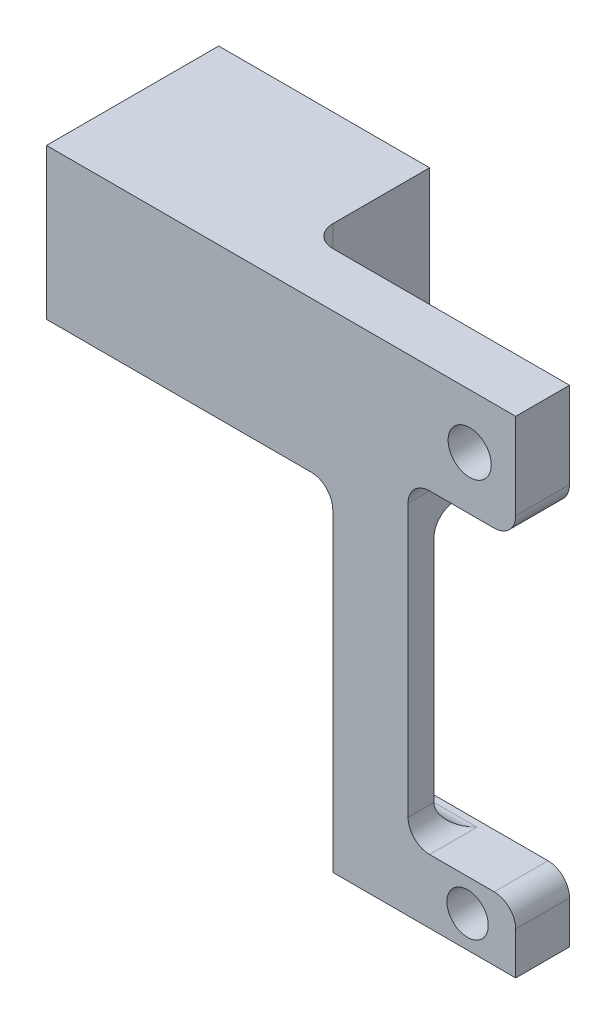
ISO-10303-21;
HEADER;
FILE_DESCRIPTION(('STEP AP214'),'2;1');
FILE_NAME('part.step','',(''),(''),'','','');
FILE_SCHEMA(('AUTOMOTIVE_DESIGN { 1 0 10303 214 1 1 1 1 }'));
ENDSEC;
DATA;
#1=APPLICATION_CONTEXT('core data for automotive mechanical design processes');
#2=APPLICATION_PROTOCOL_DEFINITION('international standard','automotive_design',2000,#1);
#3=PRODUCT_CONTEXT('',#1,'mechanical');
#4=PRODUCT('Part','Part','',(#3));
#5=PRODUCT_RELATED_PRODUCT_CATEGORY('part','',(#4));
#6=PRODUCT_DEFINITION_FORMATION('','',#4);
#7=PRODUCT_DEFINITION_CONTEXT('part definition',#1,'design');
#8=PRODUCT_DEFINITION('design','',#6,#7);
#9=PRODUCT_DEFINITION_SHAPE('','',#8);
#10=(LENGTH_UNIT() NAMED_UNIT(*) SI_UNIT(.MILLI.,.METRE.));
#11=(NAMED_UNIT(*) PLANE_ANGLE_UNIT() SI_UNIT($,.RADIAN.));
#12=(NAMED_UNIT(*) SI_UNIT($,.STERADIAN.) SOLID_ANGLE_UNIT());
#13=UNCERTAINTY_MEASURE_WITH_UNIT(LENGTH_MEASURE(1.E-05),#10,'distance_accuracy_value','');
#14=(GEOMETRIC_REPRESENTATION_CONTEXT(3) GLOBAL_UNCERTAINTY_ASSIGNED_CONTEXT((#13)) GLOBAL_UNIT_ASSIGNED_CONTEXT((#10,
#11,#12)) REPRESENTATION_CONTEXT('',''));
#15=CARTESIAN_POINT('',(0.,0.,0.));
#16=DIRECTION('',(0.,0.,1.));
#17=DIRECTION('',(1.,0.,0.));
#18=AXIS2_PLACEMENT_3D('',#15,#16,#17);
#19=CARTESIAN_POINT('',(42.672,0.,0.));
#20=DIRECTION('',(-1.,0.,0.));
#21=DIRECTION('',(0.,0.,1.));
#22=AXIS2_PLACEMENT_3D('',#19,#20,#21);
#23=PLANE('',#22);
#24=DIRECTION('',(0.,-1.,0.));
#25=VECTOR('',#24,1.);
#26=CARTESIAN_POINT('',(42.672,0.,20.32));
#27=LINE('',#26,#25);
#28=CARTESIAN_POINT('',(42.672,2.54,20.32));
#29=VERTEX_POINT('',#28);
#30=CARTESIAN_POINT('',(42.672,-29.5444696218501,20.32));
#31=VERTEX_POINT('',#30);
#32=EDGE_CURVE('E254',#29,#31,#27,.T.);
#33=ORIENTED_EDGE('',*,*,#32,.T.);
#34=DIRECTION('',(0.,0.,1.));
#35=VECTOR('',#34,1.);
#36=CARTESIAN_POINT('',(42.672,-29.5444696218501,17.272));
#37=LINE('',#36,#35);
#38=CARTESIAN_POINT('',(42.672,-29.5444696218501,17.272));
#39=VERTEX_POINT('',#38);
#40=EDGE_CURVE('E351',#31,#39,#37,.F.);
#41=ORIENTED_EDGE('',*,*,#40,.T.);
#42=DIRECTION('',(0.,1.,0.));
#43=VECTOR('',#42,1.);
#44=CARTESIAN_POINT('',(42.672,-39.624,17.272));
#45=LINE('',#44,#43);
#46=CARTESIAN_POINT('',(42.672,-2.54,17.272));
#47=VERTEX_POINT('',#46);
#48=EDGE_CURVE('E238',#39,#47,#45,.T.);
#49=ORIENTED_EDGE('',*,*,#48,.T.);
#50=CARTESIAN_POINT('',(42.672,-2.54,14.732));
#51=DIRECTION('',(-1.,0.,0.));
#52=DIRECTION('',(0.,0.,1.));
#53=AXIS2_PLACEMENT_3D('',#50,#51,#52);
#54=CIRCLE('',#53,2.54);
#55=CARTESIAN_POINT('',(42.672,0.,14.732));
#56=VERTEX_POINT('',#55);
#57=EDGE_CURVE('E361',#47,#56,#54,.T.);
#58=ORIENTED_EDGE('',*,*,#57,.T.);
#59=DIRECTION('',(0.,0.,-1.));
#60=VECTOR('',#59,1.);
#61=CARTESIAN_POINT('',(42.672,0.,20.32));
#62=LINE('',#61,#60);
#63=CARTESIAN_POINT('',(42.672,0.,13.97));
#64=VERTEX_POINT('',#63);
#65=EDGE_CURVE('E257',#56,#64,#62,.T.);
#66=ORIENTED_EDGE('',*,*,#65,.T.);
#67=DIRECTION('',(0.,1.,0.));
#68=VECTOR('',#67,1.);
#69=CARTESIAN_POINT('',(42.672,0.,13.97));
#70=LINE('',#69,#68);
#71=CARTESIAN_POINT('',(42.672,2.54,13.97));
#72=VERTEX_POINT('',#71);
#73=EDGE_CURVE('E259',#64,#72,#70,.T.);
#74=ORIENTED_EDGE('',*,*,#73,.T.);
#75=DIRECTION('',(0.,0.,-1.));
#76=VECTOR('',#75,1.);
#77=CARTESIAN_POINT('',(42.672,2.54,20.32));
#78=LINE('',#77,#76);
#79=EDGE_CURVE('E349',#72,#29,#78,.F.);
#80=ORIENTED_EDGE('',*,*,#79,.T.);
#81=EDGE_LOOP('',(#33,#41,#49,#58,#66,#74,#80));
#82=FACE_BOUND('',#81,.T.);
#83=ADVANCED_FACE('F38',(#82),#23,.F.);
#84=CARTESIAN_POINT('',(42.672,-39.624,17.272));
#85=DIRECTION('',(0.,0.,1.));
#86=DIRECTION('',(1.,0.,0.));
#87=AXIS2_PLACEMENT_3D('',#84,#85,#86);
#88=PLANE('',#87);
#89=DIRECTION('',(0.,1.,0.));
#90=VECTOR('',#89,1.);
#91=CARTESIAN_POINT('',(36.322,-39.624,17.272));
#92=LINE('',#91,#90);
#93=CARTESIAN_POINT('',(36.322,-29.5444696218501,17.272));
#94=VERTEX_POINT('',#93);
#95=CARTESIAN_POINT('',(36.322,-2.54,17.272));
#96=VERTEX_POINT('',#95);
#97=EDGE_CURVE('E305',#94,#96,#92,.T.);
#98=ORIENTED_EDGE('',*,*,#97,.T.);
#99=DIRECTION('',(1.,0.,0.));
#100=VECTOR('',#99,1.);
#101=CARTESIAN_POINT('',(42.672,-2.54,17.272));
#102=LINE('',#101,#100);
#103=EDGE_CURVE('E307',#96,#47,#102,.T.);
#104=ORIENTED_EDGE('',*,*,#103,.T.);
#105=ORIENTED_EDGE('',*,*,#48,.F.);
#106=DIRECTION('',(1.,0.,0.));
#107=VECTOR('',#106,1.);
#108=CARTESIAN_POINT('',(33.782,-29.5444696218501,17.272));
#109=LINE('',#108,#107);
#110=EDGE_CURVE('E297',#39,#94,#109,.F.);
#111=ORIENTED_EDGE('',*,*,#110,.T.);
#112=EDGE_LOOP('',(#98,#104,#105,#111));
#113=FACE_BOUND('',#112,.T.);
#114=ADVANCED_FACE('F423',(#113),#88,.F.);
#115=CARTESIAN_POINT('',(0.,0.,20.32));
#116=DIRECTION('',(0.,1.,0.));
#117=DIRECTION('',(0.,0.,1.));
#118=AXIS2_PLACEMENT_3D('',#115,#116,#117);
#119=PLANE('',#118);
#120=ORIENTED_EDGE('',*,*,#65,.F.);
#121=DIRECTION('',(1.,0.,0.));
#122=VECTOR('',#121,1.);
#123=CARTESIAN_POINT('',(33.782,0.,14.732));
#124=LINE('',#123,#122);
#125=CARTESIAN_POINT('',(36.322,0.,14.732));
#126=VERTEX_POINT('',#125);
#127=EDGE_CURVE('E315',#56,#126,#124,.F.);
#128=ORIENTED_EDGE('',*,*,#127,.T.);
#129=CARTESIAN_POINT('',(36.322,0.,19.812));
#130=DIRECTION('',(0.,1.,0.));
#131=DIRECTION('',(0.,0.,1.));
#132=AXIS2_PLACEMENT_3D('',#129,#130,#131);
#133=CIRCLE('',#132,5.08);
#134=CARTESIAN_POINT('',(31.242,0.,19.812));
#135=VERTEX_POINT('',#134);
#136=EDGE_CURVE('E312',#135,#126,#133,.F.);
#137=ORIENTED_EDGE('',*,*,#136,.F.);
#138=DIRECTION('',(0.,0.,-1.));
#139=VECTOR('',#138,1.);
#140=CARTESIAN_POINT('',(31.242,0.,20.32));
#141=LINE('',#140,#139);
#142=CARTESIAN_POINT('',(31.242,0.,20.32));
#143=VERTEX_POINT('',#142);
#144=EDGE_CURVE('E310',#135,#143,#141,.F.);
#145=ORIENTED_EDGE('',*,*,#144,.T.);
#146=DIRECTION('',(1.,0.,0.));
#147=VECTOR('',#146,1.);
#148=CARTESIAN_POINT('',(0.,0.,20.32));
#149=LINE('',#148,#147);
#150=CARTESIAN_POINT('',(0.,0.,20.32));
#151=VERTEX_POINT('',#150);
#152=EDGE_CURVE('E272',#151,#143,#149,.T.);
#153=ORIENTED_EDGE('',*,*,#152,.F.);
#154=DIRECTION('',(0.,0.,-1.));
#155=VECTOR('',#154,1.);
#156=CARTESIAN_POINT('',(0.,0.,20.32));
#157=LINE('',#156,#155);
#158=CARTESIAN_POINT('',(0.,0.,0.));
#159=VERTEX_POINT('',#158);
#160=EDGE_CURVE('E294',#151,#159,#157,.T.);
#161=ORIENTED_EDGE('',*,*,#160,.T.);
#162=DIRECTION('',(1.,0.,0.));
#163=VECTOR('',#162,1.);
#164=CARTESIAN_POINT('',(0.,0.,0.));
#165=LINE('',#164,#163);
#166=CARTESIAN_POINT('',(24.892,0.,0.));
#167=VERTEX_POINT('',#166);
#168=EDGE_CURVE('E281',#159,#167,#165,.T.);
#169=ORIENTED_EDGE('',*,*,#168,.T.);
#170=DIRECTION('',(0.,0.,-1.));
#171=VECTOR('',#170,1.);
#172=CARTESIAN_POINT('',(24.892,0.,20.32));
#173=LINE('',#172,#171);
#174=CARTESIAN_POINT('',(24.892,0.,11.43));
#175=VERTEX_POINT('',#174);
#176=EDGE_CURVE('E292',#175,#167,#173,.T.);
#177=ORIENTED_EDGE('',*,*,#176,.F.);
#178=CARTESIAN_POINT('',(27.432,0.,11.43));
#179=DIRECTION('',(0.,1.,0.));
#180=DIRECTION('',(0.,0.,1.));
#181=AXIS2_PLACEMENT_3D('',#178,#179,#180);
#182=CIRCLE('',#181,2.54);
#183=CARTESIAN_POINT('',(27.432,0.,13.97));
#184=VERTEX_POINT('',#183);
#185=EDGE_CURVE('E365',#175,#184,#182,.T.);
#186=ORIENTED_EDGE('',*,*,#185,.T.);
#187=DIRECTION('',(-1.,0.,0.));
#188=VECTOR('',#187,1.);
#189=CARTESIAN_POINT('',(42.672,0.,13.97));
#190=LINE('',#189,#188);
#191=EDGE_CURVE('E265',#64,#184,#190,.T.);
#192=ORIENTED_EDGE('',*,*,#191,.F.);
#193=EDGE_LOOP('',(#120,#128,#137,#145,#153,#161,#169,#177,#186,#192));
#194=FACE_BOUND('',#193,.T.);
#195=ADVANCED_FACE('F429',(#194),#119,.F.);
#196=CARTESIAN_POINT('',(24.892,0.,20.32));
#197=DIRECTION('',(-1.,0.,0.));
#198=DIRECTION('',(0.,0.,1.));
#199=AXIS2_PLACEMENT_3D('',#196,#197,#198);
#200=PLANE('',#199);
#201=DIRECTION('',(0.,0.,-1.));
#202=VECTOR('',#201,1.);
#203=CARTESIAN_POINT('',(24.892,17.78,20.32));
#204=LINE('',#203,#202);
#205=CARTESIAN_POINT('',(24.892,17.78,11.43));
#206=VERTEX_POINT('',#205);
#207=CARTESIAN_POINT('',(24.892,17.78,0.));
#208=VERTEX_POINT('',#207);
#209=EDGE_CURVE('E290',#206,#208,#204,.T.);
#210=ORIENTED_EDGE('',*,*,#209,.F.);
#211=DIRECTION('',(0.,1.,0.));
#212=VECTOR('',#211,1.);
#213=CARTESIAN_POINT('',(24.892,0.,11.43));
#214=LINE('',#213,#212);
#215=EDGE_CURVE('E343',#206,#175,#214,.F.);
#216=ORIENTED_EDGE('',*,*,#215,.T.);
#217=ORIENTED_EDGE('',*,*,#176,.T.);
#218=DIRECTION('',(0.,1.,0.));
#219=VECTOR('',#218,1.);
#220=CARTESIAN_POINT('',(24.892,0.,0.));
#221=LINE('',#220,#219);
#222=EDGE_CURVE('E284',#167,#208,#221,.T.);
#223=ORIENTED_EDGE('',*,*,#222,.T.);
#224=EDGE_LOOP('',(#210,#216,#217,#223));
#225=FACE_BOUND('',#224,.T.);
#226=ADVANCED_FACE('F457',(#225),#200,.F.);
#227=CARTESIAN_POINT('',(0.,0.,20.32));
#228=DIRECTION('',(1.,0.,0.));
#229=DIRECTION('',(0.,0.,-1.));
#230=AXIS2_PLACEMENT_3D('',#227,#228,#229);
#231=PLANE('',#230);
#232=DIRECTION('',(0.,-1.,0.));
#233=VECTOR('',#232,1.);
#234=CARTESIAN_POINT('',(0.,0.,0.));
#235=LINE('',#234,#233);
#236=CARTESIAN_POINT('',(0.,17.78,0.));
#237=VERTEX_POINT('',#236);
#238=EDGE_CURVE('E268',#237,#159,#235,.T.);
#239=ORIENTED_EDGE('',*,*,#238,.T.);
#240=ORIENTED_EDGE('',*,*,#160,.F.);
#241=DIRECTION('',(0.,-1.,0.));
#242=VECTOR('',#241,1.);
#243=CARTESIAN_POINT('',(0.,0.,20.32));
#244=LINE('',#243,#242);
#245=CARTESIAN_POINT('',(0.,17.78,20.32));
#246=VERTEX_POINT('',#245);
#247=EDGE_CURVE('E269',#246,#151,#244,.T.);
#248=ORIENTED_EDGE('',*,*,#247,.F.);
#249=DIRECTION('',(0.,0.,-1.));
#250=VECTOR('',#249,1.);
#251=CARTESIAN_POINT('',(0.,17.78,20.32));
#252=LINE('',#251,#250);
#253=EDGE_CURVE('E278',#246,#237,#252,.T.);
#254=ORIENTED_EDGE('',*,*,#253,.T.);
#255=EDGE_LOOP('',(#239,#240,#248,#254));
#256=FACE_BOUND('',#255,.T.);
#257=ADVANCED_FACE('F418',(#256),#231,.F.);
#258=CARTESIAN_POINT('',(0.,17.78,20.32));
#259=DIRECTION('',(0.,-1.,0.));
#260=DIRECTION('',(0.,0.,-1.));
#261=AXIS2_PLACEMENT_3D('',#258,#259,#260);
#262=PLANE('',#261);
#263=DIRECTION('',(-1.,0.,0.));
#264=VECTOR('',#263,1.);
#265=CARTESIAN_POINT('',(0.,17.78,0.));
#266=LINE('',#265,#264);
#267=EDGE_CURVE('E273',#208,#237,#266,.T.);
#268=ORIENTED_EDGE('',*,*,#267,.T.);
#269=ORIENTED_EDGE('',*,*,#253,.F.);
#270=DIRECTION('',(-1.,0.,0.));
#271=VECTOR('',#270,1.);
#272=CARTESIAN_POINT('',(0.,17.78,20.32));
#273=LINE('',#272,#271);
#274=CARTESIAN_POINT('',(55.372,17.78,20.32));
#275=VERTEX_POINT('',#274);
#276=EDGE_CURVE('E276',#275,#246,#273,.T.);
#277=ORIENTED_EDGE('',*,*,#276,.F.);
#278=DIRECTION('',(0.,0.,1.));
#279=VECTOR('',#278,1.);
#280=CARTESIAN_POINT('',(55.372,17.78,13.97));
#281=LINE('',#280,#279);
#282=CARTESIAN_POINT('',(55.372,17.78,13.97));
#283=VERTEX_POINT('',#282);
#284=EDGE_CURVE('E244',#283,#275,#281,.T.);
#285=ORIENTED_EDGE('',*,*,#284,.F.);
#286=DIRECTION('',(-1.,0.,0.));
#287=VECTOR('',#286,1.);
#288=CARTESIAN_POINT('',(42.672,17.78,13.97));
#289=LINE('',#288,#287);
#290=CARTESIAN_POINT('',(27.432,17.78,13.97));
#291=VERTEX_POINT('',#290);
#292=EDGE_CURVE('E262',#283,#291,#289,.T.);
#293=ORIENTED_EDGE('',*,*,#292,.T.);
#294=CARTESIAN_POINT('',(27.432,17.78,11.43));
#295=DIRECTION('',(0.,-1.,0.));
#296=DIRECTION('',(0.,0.,-1.));
#297=AXIS2_PLACEMENT_3D('',#294,#295,#296);
#298=CIRCLE('',#297,2.54);
#299=EDGE_CURVE('E363',#291,#206,#298,.T.);
#300=ORIENTED_EDGE('',*,*,#299,.T.);
#301=ORIENTED_EDGE('',*,*,#209,.T.);
#302=EDGE_LOOP('',(#268,#269,#277,#285,#293,#300,#301));
#303=FACE_BOUND('',#302,.T.);
#304=ADVANCED_FACE('F409',(#303),#262,.F.);
#305=CARTESIAN_POINT('',(0.,0.,20.32));
#306=DIRECTION('',(0.,0.,-1.));
#307=DIRECTION('',(-1.,0.,0.));
#308=AXIS2_PLACEMENT_3D('',#305,#306,#307);
#309=PLANE('',#308);
#310=CARTESIAN_POINT('',(49.9402134721156,11.366437705175,20.32));
#311=DIRECTION('',(0.,0.,1.));
#312=DIRECTION('',(1.,0.,0.));
#313=AXIS2_PLACEMENT_3D('',#310,#311,#312);
#314=CIRCLE('',#313,2.54768628076785);
#315=CARTESIAN_POINT('',(52.4878997528835,11.366437705175,20.32));
#316=VERTEX_POINT('',#315);
#317=EDGE_CURVE('E301',#316,#316,#314,.T.);
#318=ORIENTED_EDGE('',*,*,#317,.F.);
#319=EDGE_LOOP('',(#318));
#320=FACE_BOUND('',#319,.T.);
#321=CARTESIAN_POINT('',(49.6931777417928,-35.877562294825,20.32));
#322=DIRECTION('',(0.,0.,1.));
#323=DIRECTION('',(1.,0.,0.));
#324=AXIS2_PLACEMENT_3D('',#321,#322,#323);
#325=CIRCLE('',#324,2.43923779274074);
#326=CARTESIAN_POINT('',(52.1324155345335,-35.877562294825,20.32));
#327=VERTEX_POINT('',#326);
#328=EDGE_CURVE('E391',#327,#327,#325,.T.);
#329=ORIENTED_EDGE('',*,*,#328,.F.);
#330=EDGE_LOOP('',(#329));
#331=FACE_BOUND('',#330,.T.);
#332=DIRECTION('',(0.,-1.,0.));
#333=VECTOR('',#332,1.);
#334=CARTESIAN_POINT('',(55.372,-39.624,20.32));
#335=LINE('',#334,#333);
#336=CARTESIAN_POINT('',(55.372,-34.6244696218501,20.32));
#337=VERTEX_POINT('',#336);
#338=CARTESIAN_POINT('',(55.372,-39.624,20.32));
#339=VERTEX_POINT('',#338);
#340=EDGE_CURVE('E199',#337,#339,#335,.T.);
#341=ORIENTED_EDGE('',*,*,#340,.F.);
#342=CARTESIAN_POINT('',(52.832,-34.6244696218501,20.32));
#343=DIRECTION('',(0.,0.,-1.));
#344=DIRECTION('',(-1.,0.,0.));
#345=AXIS2_PLACEMENT_3D('',#342,#343,#344);
#346=CIRCLE('',#345,2.54);
#347=CARTESIAN_POINT('',(52.832,-32.0844696218501,20.32));
#348=VERTEX_POINT('',#347);
#349=EDGE_CURVE('E347',#337,#348,#346,.F.);
#350=ORIENTED_EDGE('',*,*,#349,.T.);
#351=DIRECTION('',(-1.,0.,0.));
#352=VECTOR('',#351,1.);
#353=CARTESIAN_POINT('',(55.372,-32.0844696218501,20.32));
#354=LINE('',#353,#352);
#355=CARTESIAN_POINT('',(45.212,-32.0844696218501,20.32));
#356=VERTEX_POINT('',#355);
#357=EDGE_CURVE('E224',#348,#356,#354,.T.);
#358=ORIENTED_EDGE('',*,*,#357,.T.);
#359=CARTESIAN_POINT('',(45.212,-29.5444696218501,20.32));
#360=DIRECTION('',(0.,0.,-1.));
#361=DIRECTION('',(-1.,0.,0.));
#362=AXIS2_PLACEMENT_3D('',#359,#360,#361);
#363=CIRCLE('',#362,2.54);
#364=EDGE_CURVE('E369',#356,#31,#363,.T.);
#365=ORIENTED_EDGE('',*,*,#364,.T.);
#366=ORIENTED_EDGE('',*,*,#32,.F.);
#367=CARTESIAN_POINT('',(45.212,2.54,20.32));
#368=DIRECTION('',(0.,0.,-1.));
#369=DIRECTION('',(-1.,0.,0.));
#370=AXIS2_PLACEMENT_3D('',#367,#368,#369);
#371=CIRCLE('',#370,2.54);
#372=CARTESIAN_POINT('',(45.212,5.08,20.32));
#373=VERTEX_POINT('',#372);
#374=EDGE_CURVE('E11',#29,#373,#371,.T.);
#375=ORIENTED_EDGE('',*,*,#374,.T.);
#376=DIRECTION('',(-1.,0.,0.));
#377=VECTOR('',#376,1.);
#378=CARTESIAN_POINT('',(55.372,5.08,20.32));
#379=LINE('',#378,#377);
#380=CARTESIAN_POINT('',(52.832,5.08,20.32));
#381=VERTEX_POINT('',#380);
#382=EDGE_CURVE('E252',#381,#373,#379,.T.);
#383=ORIENTED_EDGE('',*,*,#382,.F.);
#384=CARTESIAN_POINT('',(52.832,7.62,20.32));
#385=DIRECTION('',(0.,0.,-1.));
#386=DIRECTION('',(-1.,0.,0.));
#387=AXIS2_PLACEMENT_3D('',#384,#385,#386);
#388=CIRCLE('',#387,2.54);
#389=CARTESIAN_POINT('',(55.372,7.62,20.32));
#390=VERTEX_POINT('',#389);
#391=EDGE_CURVE('E55',#381,#390,#388,.F.);
#392=ORIENTED_EDGE('',*,*,#391,.T.);
#393=DIRECTION('',(0.,-1.,0.));
#394=VECTOR('',#393,1.);
#395=CARTESIAN_POINT('',(55.372,17.78,20.32));
#396=LINE('',#395,#394);
#397=EDGE_CURVE('E247',#275,#390,#396,.T.);
#398=ORIENTED_EDGE('',*,*,#397,.F.);
#399=ORIENTED_EDGE('',*,*,#276,.T.);
#400=ORIENTED_EDGE('',*,*,#247,.T.);
#401=ORIENTED_EDGE('',*,*,#152,.T.);
#402=CARTESIAN_POINT('',(31.242,-2.54,20.32));
#403=DIRECTION('',(0.,0.,-1.));
#404=DIRECTION('',(-1.,0.,0.));
#405=AXIS2_PLACEMENT_3D('',#402,#403,#404);
#406=CIRCLE('',#405,2.54);
#407=CARTESIAN_POINT('',(33.782,-2.54,20.32));
#408=VERTEX_POINT('',#407);
#409=EDGE_CURVE('E367',#143,#408,#406,.T.);
#410=ORIENTED_EDGE('',*,*,#409,.T.);
#411=DIRECTION('',(0.,1.,0.));
#412=VECTOR('',#411,1.);
#413=CARTESIAN_POINT('',(33.782,-39.624,20.32));
#414=LINE('',#413,#412);
#415=CARTESIAN_POINT('',(33.782,-39.624,20.32));
#416=VERTEX_POINT('',#415);
#417=EDGE_CURVE('E214',#416,#408,#414,.T.);
#418=ORIENTED_EDGE('',*,*,#417,.F.);
#419=DIRECTION('',(-1.,0.,0.));
#420=VECTOR('',#419,1.);
#421=CARTESIAN_POINT('',(42.672,-39.624,20.32));
#422=LINE('',#421,#420);
#423=EDGE_CURVE('E211',#339,#416,#422,.T.);
#424=ORIENTED_EDGE('',*,*,#423,.F.);
#425=EDGE_LOOP('',(#341,#350,#358,#365,#366,#375,#383,#392,#398,#399,#400,#401,#410,#418,#424));
#426=FACE_BOUND('',#425,.T.);
#427=ADVANCED_FACE('F212',(#320,#331,#426),#309,.F.);
#428=CARTESIAN_POINT('',(0.,0.,0.));
#429=DIRECTION('',(0.,0.,-1.));
#430=DIRECTION('',(-1.,0.,0.));
#431=AXIS2_PLACEMENT_3D('',#428,#429,#430);
#432=PLANE('',#431);
#433=ORIENTED_EDGE('',*,*,#238,.F.);
#434=ORIENTED_EDGE('',*,*,#267,.F.);
#435=ORIENTED_EDGE('',*,*,#222,.F.);
#436=ORIENTED_EDGE('',*,*,#168,.F.);
#437=EDGE_LOOP('',(#433,#434,#435,#436));
#438=FACE_BOUND('',#437,.T.);
#439=ADVANCED_FACE('F408',(#438),#432,.T.);
#440=CARTESIAN_POINT('',(42.672,0.,13.97));
#441=DIRECTION('',(0.,0.,1.));
#442=DIRECTION('',(1.,0.,0.));
#443=AXIS2_PLACEMENT_3D('',#440,#441,#442);
#444=PLANE('',#443);
#445=CARTESIAN_POINT('',(49.9402134721156,11.366437705175,13.97));
#446=DIRECTION('',(0.,0.,1.));
#447=DIRECTION('',(1.,0.,0.));
#448=AXIS2_PLACEMENT_3D('',#445,#446,#447);
#449=CIRCLE('',#448,2.54768628076785);
#450=CARTESIAN_POINT('',(52.4878997528835,11.366437705175,13.97));
#451=VERTEX_POINT('',#450);
#452=EDGE_CURVE('E208',#451,#451,#449,.T.);
#453=ORIENTED_EDGE('',*,*,#452,.T.);
#454=EDGE_LOOP('',(#453));
#455=FACE_BOUND('',#454,.T.);
#456=ORIENTED_EDGE('',*,*,#191,.T.);
#457=DIRECTION('',(0.,1.,0.));
#458=VECTOR('',#457,1.);
#459=CARTESIAN_POINT('',(27.432,17.78,13.97));
#460=LINE('',#459,#458);
#461=EDGE_CURVE('E340',#184,#291,#460,.T.);
#462=ORIENTED_EDGE('',*,*,#461,.T.);
#463=ORIENTED_EDGE('',*,*,#292,.F.);
#464=DIRECTION('',(0.,1.,0.));
#465=VECTOR('',#464,1.);
#466=CARTESIAN_POINT('',(55.372,17.78,13.97));
#467=LINE('',#466,#465);
#468=CARTESIAN_POINT('',(55.372,7.62,13.97));
#469=VERTEX_POINT('',#468);
#470=EDGE_CURVE('E242',#469,#283,#467,.T.);
#471=ORIENTED_EDGE('',*,*,#470,.F.);
#472=CARTESIAN_POINT('',(52.832,7.62,13.97));
#473=DIRECTION('',(0.,0.,1.));
#474=DIRECTION('',(1.,0.,0.));
#475=AXIS2_PLACEMENT_3D('',#472,#473,#474);
#476=CIRCLE('',#475,2.54);
#477=CARTESIAN_POINT('',(52.832,5.08,13.97));
#478=VERTEX_POINT('',#477);
#479=EDGE_CURVE('E338',#469,#478,#476,.F.);
#480=ORIENTED_EDGE('',*,*,#479,.T.);
#481=DIRECTION('',(-1.,0.,0.));
#482=VECTOR('',#481,1.);
#483=CARTESIAN_POINT('',(55.372,5.08,13.97));
#484=LINE('',#483,#482);
#485=CARTESIAN_POINT('',(45.212,5.08,13.97));
#486=VERTEX_POINT('',#485);
#487=EDGE_CURVE('E249',#478,#486,#484,.T.);
#488=ORIENTED_EDGE('',*,*,#487,.T.);
#489=CARTESIAN_POINT('',(45.212,2.54,13.97));
#490=DIRECTION('',(0.,0.,1.));
#491=DIRECTION('',(1.,0.,0.));
#492=AXIS2_PLACEMENT_3D('',#489,#490,#491);
#493=CIRCLE('',#492,2.54);
#494=EDGE_CURVE('E47',#486,#72,#493,.T.);
#495=ORIENTED_EDGE('',*,*,#494,.T.);
#496=ORIENTED_EDGE('',*,*,#73,.F.);
#497=EDGE_LOOP('',(#456,#462,#463,#471,#480,#488,#495,#496));
#498=FACE_BOUND('',#497,.T.);
#499=ADVANCED_FACE('F415',(#455,#498),#444,.F.);
#500=CARTESIAN_POINT('',(55.372,5.08,13.97));
#501=DIRECTION('',(0.,1.,0.));
#502=DIRECTION('',(0.,0.,1.));
#503=AXIS2_PLACEMENT_3D('',#500,#501,#502);
#504=PLANE('',#503);
#505=ORIENTED_EDGE('',*,*,#487,.F.);
#506=DIRECTION('',(0.,0.,-1.));
#507=VECTOR('',#506,1.);
#508=CARTESIAN_POINT('',(52.832,5.08,13.97));
#509=LINE('',#508,#507);
#510=EDGE_CURVE('E359',#478,#381,#509,.F.);
#511=ORIENTED_EDGE('',*,*,#510,.T.);
#512=ORIENTED_EDGE('',*,*,#382,.T.);
#513=DIRECTION('',(0.,0.,-1.));
#514=VECTOR('',#513,1.);
#515=CARTESIAN_POINT('',(45.212,5.08,13.97));
#516=LINE('',#515,#514);
#517=EDGE_CURVE('E356',#373,#486,#516,.T.);
#518=ORIENTED_EDGE('',*,*,#517,.T.);
#519=EDGE_LOOP('',(#505,#511,#512,#518));
#520=FACE_BOUND('',#519,.T.);
#521=ADVANCED_FACE('F433',(#520),#504,.F.);
#522=CARTESIAN_POINT('',(55.372,0.,0.));
#523=DIRECTION('',(-1.,0.,0.));
#524=DIRECTION('',(0.,0.,1.));
#525=AXIS2_PLACEMENT_3D('',#522,#523,#524);
#526=PLANE('',#525);
#527=ORIENTED_EDGE('',*,*,#397,.T.);
#528=DIRECTION('',(0.,0.,-1.));
#529=VECTOR('',#528,1.);
#530=CARTESIAN_POINT('',(55.372,7.62,0.));
#531=LINE('',#530,#529);
#532=EDGE_CURVE('E353',#390,#469,#531,.T.);
#533=ORIENTED_EDGE('',*,*,#532,.T.);
#534=ORIENTED_EDGE('',*,*,#470,.T.);
#535=ORIENTED_EDGE('',*,*,#284,.T.);
#536=EDGE_LOOP('',(#527,#533,#534,#535));
#537=FACE_BOUND('',#536,.T.);
#538=ADVANCED_FACE('F440',(#537),#526,.F.);
#539=CARTESIAN_POINT('',(33.782,-39.624,20.32));
#540=DIRECTION('',(1.,0.,0.));
#541=DIRECTION('',(0.,0.,-1.));
#542=AXIS2_PLACEMENT_3D('',#539,#540,#541);
#543=PLANE('',#542);
#544=CARTESIAN_POINT('',(33.782,-29.5444696218501,14.732));
#545=DIRECTION('',(1.,0.,0.));
#546=DIRECTION('',(0.,0.,-1.));
#547=AXIS2_PLACEMENT_3D('',#544,#545,#546);
#548=CIRCLE('',#547,5.08);
#549=CARTESIAN_POINT('',(33.782,-34.6244696218501,14.732));
#550=VERTEX_POINT('',#549);
#551=CARTESIAN_POINT('',(33.782,-29.5444696218501,19.812));
#552=VERTEX_POINT('',#551);
#553=EDGE_CURVE('E321',#550,#552,#548,.F.);
#554=ORIENTED_EDGE('',*,*,#553,.F.);
#555=DIRECTION('',(0.,0.,1.));
#556=VECTOR('',#555,1.);
#557=CARTESIAN_POINT('',(33.782,-34.6244696218501,20.32));
#558=LINE('',#557,#556);
#559=CARTESIAN_POINT('',(33.782,-34.6244696218501,13.97));
#560=VERTEX_POINT('',#559);
#561=EDGE_CURVE('E324',#550,#560,#558,.F.);
#562=ORIENTED_EDGE('',*,*,#561,.T.);
#563=DIRECTION('',(0.,1.,0.));
#564=VECTOR('',#563,1.);
#565=CARTESIAN_POINT('',(33.782,-39.624,13.97));
#566=LINE('',#565,#564);
#567=CARTESIAN_POINT('',(33.782,-39.624,13.97));
#568=VERTEX_POINT('',#567);
#569=EDGE_CURVE('E230',#568,#560,#566,.T.);
#570=ORIENTED_EDGE('',*,*,#569,.F.);
#571=DIRECTION('',(0.,0.,-1.));
#572=VECTOR('',#571,1.);
#573=CARTESIAN_POINT('',(33.782,-39.624,20.32));
#574=LINE('',#573,#572);
#575=EDGE_CURVE('E217',#416,#568,#574,.T.);
#576=ORIENTED_EDGE('',*,*,#575,.F.);
#577=ORIENTED_EDGE('',*,*,#417,.T.);
#578=DIRECTION('',(0.,0.,-1.));
#579=VECTOR('',#578,1.);
#580=CARTESIAN_POINT('',(33.782,-2.54,17.272));
#581=LINE('',#580,#579);
#582=CARTESIAN_POINT('',(33.782,-2.54,19.812));
#583=VERTEX_POINT('',#582);
#584=EDGE_CURVE('E317',#408,#583,#581,.T.);
#585=ORIENTED_EDGE('',*,*,#584,.T.);
#586=DIRECTION('',(0.,1.,0.));
#587=VECTOR('',#586,1.);
#588=CARTESIAN_POINT('',(33.782,-39.624,19.812));
#589=LINE('',#588,#587);
#590=EDGE_CURVE('E319',#583,#552,#589,.F.);
#591=ORIENTED_EDGE('',*,*,#590,.T.);
#592=EDGE_LOOP('',(#554,#562,#570,#576,#577,#585,#591));
#593=FACE_BOUND('',#592,.T.);
#594=ADVANCED_FACE('F564',(#593),#543,.F.);
#595=CARTESIAN_POINT('',(0.,-39.624,0.));
#596=DIRECTION('',(0.,1.,0.));
#597=DIRECTION('',(0.,0.,1.));
#598=AXIS2_PLACEMENT_3D('',#595,#596,#597);
#599=PLANE('',#598);
#600=DIRECTION('',(-1.,0.,0.));
#601=VECTOR('',#600,1.);
#602=CARTESIAN_POINT('',(33.782,-39.624,13.97));
#603=LINE('',#602,#601);
#604=CARTESIAN_POINT('',(55.372,-39.624,13.97));
#605=VERTEX_POINT('',#604);
#606=EDGE_CURVE('E218',#605,#568,#603,.T.);
#607=ORIENTED_EDGE('',*,*,#606,.F.);
#608=DIRECTION('',(0.,0.,-1.));
#609=VECTOR('',#608,1.);
#610=CARTESIAN_POINT('',(55.372,-39.624,20.32));
#611=LINE('',#610,#609);
#612=EDGE_CURVE('E204',#339,#605,#611,.T.);
#613=ORIENTED_EDGE('',*,*,#612,.F.);
#614=ORIENTED_EDGE('',*,*,#423,.T.);
#615=ORIENTED_EDGE('',*,*,#575,.T.);
#616=EDGE_LOOP('',(#607,#613,#614,#615));
#617=FACE_BOUND('',#616,.T.);
#618=ADVANCED_FACE('F220',(#617),#599,.F.);
#619=CARTESIAN_POINT('',(33.782,-32.0844696218501,13.97));
#620=DIRECTION('',(0.,-1.,0.));
#621=DIRECTION('',(0.,0.,-1.));
#622=AXIS2_PLACEMENT_3D('',#619,#620,#621);
#623=PLANE('',#622);
#624=ORIENTED_EDGE('',*,*,#357,.F.);
#625=DIRECTION('',(0.,0.,1.));
#626=VECTOR('',#625,1.);
#627=CARTESIAN_POINT('',(52.832,-32.0844696218501,13.97));
#628=LINE('',#627,#626);
#629=CARTESIAN_POINT('',(52.832,-32.0844696218501,13.97));
#630=VERTEX_POINT('',#629);
#631=EDGE_CURVE('E332',#348,#630,#628,.F.);
#632=ORIENTED_EDGE('',*,*,#631,.T.);
#633=DIRECTION('',(1.,0.,0.));
#634=VECTOR('',#633,1.);
#635=CARTESIAN_POINT('',(33.782,-32.0844696218501,13.97));
#636=LINE('',#635,#634);
#637=CARTESIAN_POINT('',(36.322,-32.0844696218501,13.97));
#638=VERTEX_POINT('',#637);
#639=EDGE_CURVE('E233',#638,#630,#636,.T.);
#640=ORIENTED_EDGE('',*,*,#639,.F.);
#641=DIRECTION('',(0.,0.,1.));
#642=VECTOR('',#641,1.);
#643=CARTESIAN_POINT('',(36.322,-32.0844696218501,13.97));
#644=LINE('',#643,#642);
#645=CARTESIAN_POINT('',(36.322,-32.0844696218501,14.732));
#646=VERTEX_POINT('',#645);
#647=EDGE_CURVE('E330',#638,#646,#644,.T.);
#648=ORIENTED_EDGE('',*,*,#647,.T.);
#649=DIRECTION('',(1.,0.,0.));
#650=VECTOR('',#649,1.);
#651=CARTESIAN_POINT('',(42.672,-32.0844696218501,14.732));
#652=LINE('',#651,#650);
#653=CARTESIAN_POINT('',(45.212,-32.0844696218501,14.732));
#654=VERTEX_POINT('',#653);
#655=EDGE_CURVE('E328',#646,#654,#652,.T.);
#656=ORIENTED_EDGE('',*,*,#655,.T.);
#657=DIRECTION('',(0.,0.,1.));
#658=VECTOR('',#657,1.);
#659=CARTESIAN_POINT('',(45.212,-32.0844696218501,20.32));
#660=LINE('',#659,#658);
#661=EDGE_CURVE('E326',#654,#356,#660,.T.);
#662=ORIENTED_EDGE('',*,*,#661,.T.);
#663=EDGE_LOOP('',(#624,#632,#640,#648,#656,#662));
#664=FACE_BOUND('',#663,.T.);
#665=ADVANCED_FACE('F582',(#664),#623,.F.);
#666=CARTESIAN_POINT('',(0.,0.,13.97));
#667=DIRECTION('',(0.,0.,-1.));
#668=DIRECTION('',(-1.,0.,0.));
#669=AXIS2_PLACEMENT_3D('',#666,#667,#668);
#670=PLANE('',#669);
#671=CARTESIAN_POINT('',(49.6931777417928,-35.877562294825,13.97));
#672=DIRECTION('',(0.,0.,-1.));
#673=DIRECTION('',(-1.,0.,0.));
#674=AXIS2_PLACEMENT_3D('',#671,#672,#673);
#675=CIRCLE('',#674,2.43923779274074);
#676=CARTESIAN_POINT('',(47.2539399490521,-35.877562294825,13.97));
#677=VERTEX_POINT('',#676);
#678=EDGE_CURVE('E298',#677,#677,#675,.T.);
#679=ORIENTED_EDGE('',*,*,#678,.F.);
#680=EDGE_LOOP('',(#679));
#681=FACE_BOUND('',#680,.T.);
#682=ORIENTED_EDGE('',*,*,#569,.T.);
#683=CARTESIAN_POINT('',(36.322,-34.6244696218501,13.97));
#684=DIRECTION('',(0.,0.,-1.));
#685=DIRECTION('',(-1.,0.,0.));
#686=AXIS2_PLACEMENT_3D('',#683,#684,#685);
#687=CIRCLE('',#686,2.54);
#688=EDGE_CURVE('E336',#560,#638,#687,.T.);
#689=ORIENTED_EDGE('',*,*,#688,.T.);
#690=ORIENTED_EDGE('',*,*,#639,.T.);
#691=CARTESIAN_POINT('',(52.832,-34.6244696218501,13.97));
#692=DIRECTION('',(0.,0.,-1.));
#693=DIRECTION('',(-1.,0.,0.));
#694=AXIS2_PLACEMENT_3D('',#691,#692,#693);
#695=CIRCLE('',#694,2.54);
#696=CARTESIAN_POINT('',(55.372,-34.6244696218501,13.97));
#697=VERTEX_POINT('',#696);
#698=EDGE_CURVE('E334',#630,#697,#695,.T.);
#699=ORIENTED_EDGE('',*,*,#698,.T.);
#700=DIRECTION('',(0.,1.,0.));
#701=VECTOR('',#700,1.);
#702=CARTESIAN_POINT('',(55.372,-39.624,13.97));
#703=LINE('',#702,#701);
#704=EDGE_CURVE('E222',#605,#697,#703,.T.);
#705=ORIENTED_EDGE('',*,*,#704,.F.);
#706=ORIENTED_EDGE('',*,*,#606,.T.);
#707=EDGE_LOOP('',(#682,#689,#690,#699,#705,#706));
#708=FACE_BOUND('',#707,.T.);
#709=ADVANCED_FACE('F587',(#681,#708),#670,.T.);
#710=CARTESIAN_POINT('',(55.372,0.,0.));
#711=DIRECTION('',(-1.,0.,0.));
#712=DIRECTION('',(0.,0.,1.));
#713=AXIS2_PLACEMENT_3D('',#710,#711,#712);
#714=PLANE('',#713);
#715=ORIENTED_EDGE('',*,*,#704,.T.);
#716=DIRECTION('',(0.,0.,1.));
#717=VECTOR('',#716,1.);
#718=CARTESIAN_POINT('',(55.372,-34.6244696218501,0.));
#719=LINE('',#718,#717);
#720=EDGE_CURVE('E207',#697,#337,#719,.T.);
#721=ORIENTED_EDGE('',*,*,#720,.T.);
#722=ORIENTED_EDGE('',*,*,#340,.T.);
#723=ORIENTED_EDGE('',*,*,#612,.T.);
#724=EDGE_LOOP('',(#715,#721,#722,#723));
#725=FACE_BOUND('',#724,.T.);
#726=ADVANCED_FACE('F202',(#725),#714,.F.);
#727=CARTESIAN_POINT('',(49.6931777417928,-35.877562294825,0.));
#728=DIRECTION('',(0.,0.,1.));
#729=DIRECTION('',(1.,0.,0.));
#730=AXIS2_PLACEMENT_3D('',#727,#728,#729);
#731=CYLINDRICAL_SURFACE('',#730,2.43923779274074);
#732=ORIENTED_EDGE('',*,*,#678,.T.);
#733=EDGE_LOOP('',(#732));
#734=FACE_BOUND('',#733,.T.);
#735=ORIENTED_EDGE('',*,*,#328,.T.);
#736=EDGE_LOOP('',(#735));
#737=FACE_BOUND('',#736,.T.);
#738=ADVANCED_FACE('F608',(#734,#737),#731,.F.);
#739=CARTESIAN_POINT('',(49.9402134721156,11.366437705175,0.));
#740=DIRECTION('',(0.,0.,1.));
#741=DIRECTION('',(1.,0.,0.));
#742=AXIS2_PLACEMENT_3D('',#739,#740,#741);
#743=CYLINDRICAL_SURFACE('',#742,2.54768628076785);
#744=ORIENTED_EDGE('',*,*,#317,.T.);
#745=EDGE_LOOP('',(#744));
#746=FACE_BOUND('',#745,.T.);
#747=ORIENTED_EDGE('',*,*,#452,.F.);
#748=EDGE_LOOP('',(#747));
#749=FACE_BOUND('',#748,.T.);
#750=ADVANCED_FACE('F403',(#746,#749),#743,.F.);
#751=CARTESIAN_POINT('',(45.212,-29.5444696218501,13.97));
#752=DIRECTION('',(0.,0.,-1.));
#753=DIRECTION('',(-1.,0.,0.));
#754=AXIS2_PLACEMENT_3D('',#751,#752,#753);
#755=CYLINDRICAL_SURFACE('',#754,2.54);
#756=ORIENTED_EDGE('',*,*,#364,.F.);
#757=ORIENTED_EDGE('',*,*,#661,.F.);
#758=CARTESIAN_POINT('',(45.212,-29.5444696218501,14.732));
#759=DIRECTION('',(-0.707106781186547,0.,-0.707106781186548));
#760=DIRECTION('',(0.707106781186548,0.,-0.707106781186547));
#761=AXIS2_PLACEMENT_3D('',#758,#759,#760);
#762=ELLIPSE('',#761,3.59210244842766,2.54);
#763=EDGE_CURVE('E42',#39,#654,#762,.F.);
#764=ORIENTED_EDGE('',*,*,#763,.F.);
#765=ORIENTED_EDGE('',*,*,#40,.F.);
#766=EDGE_LOOP('',(#756,#757,#764,#765));
#767=FACE_BOUND('',#766,.T.);
#768=ADVANCED_FACE('F488',(#767),#755,.F.);
#769=CARTESIAN_POINT('',(36.322,-34.6244696218501,13.97));
#770=DIRECTION('',(0.,0.,1.));
#771=DIRECTION('',(1.,0.,0.));
#772=AXIS2_PLACEMENT_3D('',#769,#770,#771);
#773=CYLINDRICAL_SURFACE('',#772,2.54);
#774=ORIENTED_EDGE('',*,*,#688,.F.);
#775=ORIENTED_EDGE('',*,*,#561,.F.);
#776=CARTESIAN_POINT('',(36.322,-34.6244696218501,14.732));
#777=DIRECTION('',(0.,0.,1.));
#778=DIRECTION('',(1.,0.,0.));
#779=AXIS2_PLACEMENT_3D('',#776,#777,#778);
#780=CIRCLE('',#779,2.54);
#781=EDGE_CURVE('E386',#646,#550,#780,.T.);
#782=ORIENTED_EDGE('',*,*,#781,.F.);
#783=ORIENTED_EDGE('',*,*,#647,.F.);
#784=EDGE_LOOP('',(#774,#775,#782,#783));
#785=FACE_BOUND('',#784,.T.);
#786=ADVANCED_FACE('F491',(#785),#773,.T.);
#787=CARTESIAN_POINT('',(33.782,-29.5444696218501,14.732));
#788=DIRECTION('',(-1.,0.,0.));
#789=DIRECTION('',(0.,0.,1.));
#790=AXIS2_PLACEMENT_3D('',#787,#788,#789);
#791=CYLINDRICAL_SURFACE('',#790,2.54);
#792=ORIENTED_EDGE('',*,*,#763,.T.);
#793=ORIENTED_EDGE('',*,*,#655,.F.);
#794=CARTESIAN_POINT('',(36.322,-29.5444696218501,14.732));
#795=DIRECTION('',(1.,0.,0.));
#796=DIRECTION('',(0.,0.,-1.));
#797=AXIS2_PLACEMENT_3D('',#794,#795,#796);
#798=CIRCLE('',#797,2.54);
#799=EDGE_CURVE('E384',#94,#646,#798,.T.);
#800=ORIENTED_EDGE('',*,*,#799,.F.);
#801=ORIENTED_EDGE('',*,*,#110,.F.);
#802=EDGE_LOOP('',(#792,#793,#800,#801));
#803=FACE_BOUND('',#802,.T.);
#804=ADVANCED_FACE('F495',(#803),#791,.F.);
#805=CARTESIAN_POINT('',(36.322,-29.5444696218501,14.732));
#806=DIRECTION('',(1.,0.,0.));
#807=DIRECTION('',(0.,0.,-1.));
#808=AXIS2_PLACEMENT_3D('',#805,#806,#807);
#809=TOROIDAL_SURFACE('',#808,5.08,2.54);
#810=ORIENTED_EDGE('',*,*,#781,.T.);
#811=ORIENTED_EDGE('',*,*,#553,.T.);
#812=CARTESIAN_POINT('',(36.322,-29.5444696218501,19.812));
#813=DIRECTION('',(0.,-1.,0.));
#814=DIRECTION('',(0.,0.,-1.));
#815=AXIS2_PLACEMENT_3D('',#812,#813,#814);
#816=CIRCLE('',#815,2.54);
#817=EDGE_CURVE('E381',#94,#552,#816,.F.);
#818=ORIENTED_EDGE('',*,*,#817,.F.);
#819=ORIENTED_EDGE('',*,*,#799,.T.);
#820=EDGE_LOOP('',(#810,#811,#818,#819));
#821=FACE_BOUND('',#820,.T.);
#822=ADVANCED_FACE('F499',(#821),#809,.T.);
#823=CARTESIAN_POINT('',(31.242,-2.54,20.32));
#824=DIRECTION('',(0.,0.,1.));
#825=DIRECTION('',(1.,0.,0.));
#826=AXIS2_PLACEMENT_3D('',#823,#824,#825);
#827=CYLINDRICAL_SURFACE('',#826,2.54);
#828=ORIENTED_EDGE('',*,*,#409,.F.);
#829=ORIENTED_EDGE('',*,*,#144,.F.);
#830=CARTESIAN_POINT('',(31.242,-2.54,19.812));
#831=DIRECTION('',(0.,0.,1.));
#832=DIRECTION('',(1.,0.,0.));
#833=AXIS2_PLACEMENT_3D('',#830,#831,#832);
#834=CIRCLE('',#833,2.54);
#835=EDGE_CURVE('E378',#583,#135,#834,.T.);
#836=ORIENTED_EDGE('',*,*,#835,.F.);
#837=ORIENTED_EDGE('',*,*,#584,.F.);
#838=EDGE_LOOP('',(#828,#829,#836,#837));
#839=FACE_BOUND('',#838,.T.);
#840=ADVANCED_FACE('F502',(#839),#827,.F.);
#841=CARTESIAN_POINT('',(36.322,-39.624,19.812));
#842=DIRECTION('',(0.,1.,0.));
#843=DIRECTION('',(0.,0.,1.));
#844=AXIS2_PLACEMENT_3D('',#841,#842,#843);
#845=CYLINDRICAL_SURFACE('',#844,2.54);
#846=ORIENTED_EDGE('',*,*,#817,.T.);
#847=ORIENTED_EDGE('',*,*,#590,.F.);
#848=CARTESIAN_POINT('',(36.322,-2.54,19.812));
#849=DIRECTION('',(0.,1.,0.));
#850=DIRECTION('',(0.,0.,1.));
#851=AXIS2_PLACEMENT_3D('',#848,#849,#850);
#852=CIRCLE('',#851,2.54);
#853=EDGE_CURVE('E375',#96,#583,#852,.T.);
#854=ORIENTED_EDGE('',*,*,#853,.F.);
#855=ORIENTED_EDGE('',*,*,#97,.F.);
#856=EDGE_LOOP('',(#846,#847,#854,#855));
#857=FACE_BOUND('',#856,.T.);
#858=ADVANCED_FACE('F505',(#857),#845,.T.);
#859=CARTESIAN_POINT('',(36.322,-2.54,19.812));
#860=DIRECTION('',(0.,1.,0.));
#861=DIRECTION('',(0.,0.,1.));
#862=AXIS2_PLACEMENT_3D('',#859,#860,#861);
#863=TOROIDAL_SURFACE('',#862,5.08,2.54);
#864=ORIENTED_EDGE('',*,*,#835,.T.);
#865=ORIENTED_EDGE('',*,*,#136,.T.);
#866=CARTESIAN_POINT('',(36.322,-2.54,14.732));
#867=DIRECTION('',(1.,0.,0.));
#868=DIRECTION('',(0.,0.,-1.));
#869=AXIS2_PLACEMENT_3D('',#866,#867,#868);
#870=CIRCLE('',#869,2.54);
#871=EDGE_CURVE('E372',#96,#126,#870,.F.);
#872=ORIENTED_EDGE('',*,*,#871,.F.);
#873=ORIENTED_EDGE('',*,*,#853,.T.);
#874=EDGE_LOOP('',(#864,#865,#872,#873));
#875=FACE_BOUND('',#874,.T.);
#876=ADVANCED_FACE('F509',(#875),#863,.F.);
#877=CARTESIAN_POINT('',(42.672,-2.54,14.732));
#878=DIRECTION('',(-1.,0.,0.));
#879=DIRECTION('',(0.,0.,1.));
#880=AXIS2_PLACEMENT_3D('',#877,#878,#879);
#881=CYLINDRICAL_SURFACE('',#880,2.54);
#882=ORIENTED_EDGE('',*,*,#871,.T.);
#883=ORIENTED_EDGE('',*,*,#127,.F.);
#884=ORIENTED_EDGE('',*,*,#57,.F.);
#885=ORIENTED_EDGE('',*,*,#103,.F.);
#886=EDGE_LOOP('',(#882,#883,#884,#885));
#887=FACE_BOUND('',#886,.T.);
#888=ADVANCED_FACE('F487',(#887),#881,.F.);
#889=CARTESIAN_POINT('',(27.432,0.,11.43));
#890=DIRECTION('',(0.,-1.,0.));
#891=DIRECTION('',(0.,0.,-1.));
#892=AXIS2_PLACEMENT_3D('',#889,#890,#891);
#893=CYLINDRICAL_SURFACE('',#892,2.54);
#894=ORIENTED_EDGE('',*,*,#185,.F.);
#895=ORIENTED_EDGE('',*,*,#215,.F.);
#896=ORIENTED_EDGE('',*,*,#299,.F.);
#897=ORIENTED_EDGE('',*,*,#461,.F.);
#898=EDGE_LOOP('',(#894,#895,#896,#897));
#899=FACE_BOUND('',#898,.T.);
#900=ADVANCED_FACE('F452',(#899),#893,.F.);
#901=CARTESIAN_POINT('',(52.832,-34.6244696218501,0.));
#902=DIRECTION('',(0.,0.,1.));
#903=DIRECTION('',(1.,0.,0.));
#904=AXIS2_PLACEMENT_3D('',#901,#902,#903);
#905=CYLINDRICAL_SURFACE('',#904,2.54);
#906=ORIENTED_EDGE('',*,*,#698,.F.);
#907=ORIENTED_EDGE('',*,*,#631,.F.);
#908=ORIENTED_EDGE('',*,*,#349,.F.);
#909=ORIENTED_EDGE('',*,*,#720,.F.);
#910=EDGE_LOOP('',(#906,#907,#908,#909));
#911=FACE_BOUND('',#910,.T.);
#912=ADVANCED_FACE('F476',(#911),#905,.T.);
#913=CARTESIAN_POINT('',(52.832,7.62,0.));
#914=DIRECTION('',(0.,0.,-1.));
#915=DIRECTION('',(0.,1.,0.));
#916=AXIS2_PLACEMENT_3D('',#913,#914,#915);
#917=CYLINDRICAL_SURFACE('',#916,2.54);
#918=ORIENTED_EDGE('',*,*,#391,.F.);
#919=ORIENTED_EDGE('',*,*,#510,.F.);
#920=ORIENTED_EDGE('',*,*,#479,.F.);
#921=ORIENTED_EDGE('',*,*,#532,.F.);
#922=EDGE_LOOP('',(#918,#919,#920,#921));
#923=FACE_BOUND('',#922,.T.);
#924=ADVANCED_FACE('F474',(#923),#917,.T.);
#925=CARTESIAN_POINT('',(45.212,2.54,13.97));
#926=DIRECTION('',(0.,0.,1.));
#927=DIRECTION('',(0.,-1.,0.));
#928=AXIS2_PLACEMENT_3D('',#925,#926,#927);
#929=CYLINDRICAL_SURFACE('',#928,2.54);
#930=ORIENTED_EDGE('',*,*,#374,.F.);
#931=ORIENTED_EDGE('',*,*,#79,.F.);
#932=ORIENTED_EDGE('',*,*,#494,.F.);
#933=ORIENTED_EDGE('',*,*,#517,.F.);
#934=EDGE_LOOP('',(#930,#931,#932,#933));
#935=FACE_BOUND('',#934,.T.);
#936=ADVANCED_FACE('F40',(#935),#929,.F.);
#937=CLOSED_SHELL('',(#83,#114,#195,#226,#257,#304,#427,#439,#499,#521,#538,#594,#618,#665,#709,
#726,#738,#750,#768,#786,#804,#822,#840,#858,#876,#888,#900,#912,#924,#936));
#938=MANIFOLD_SOLID_BREP('B2',#937);
#939=ADVANCED_BREP_SHAPE_REPRESENTATION('',(#18,#938),#14);
#940=SHAPE_DEFINITION_REPRESENTATION(#9,#939);
ENDSEC;
END-ISO-10303-21;
